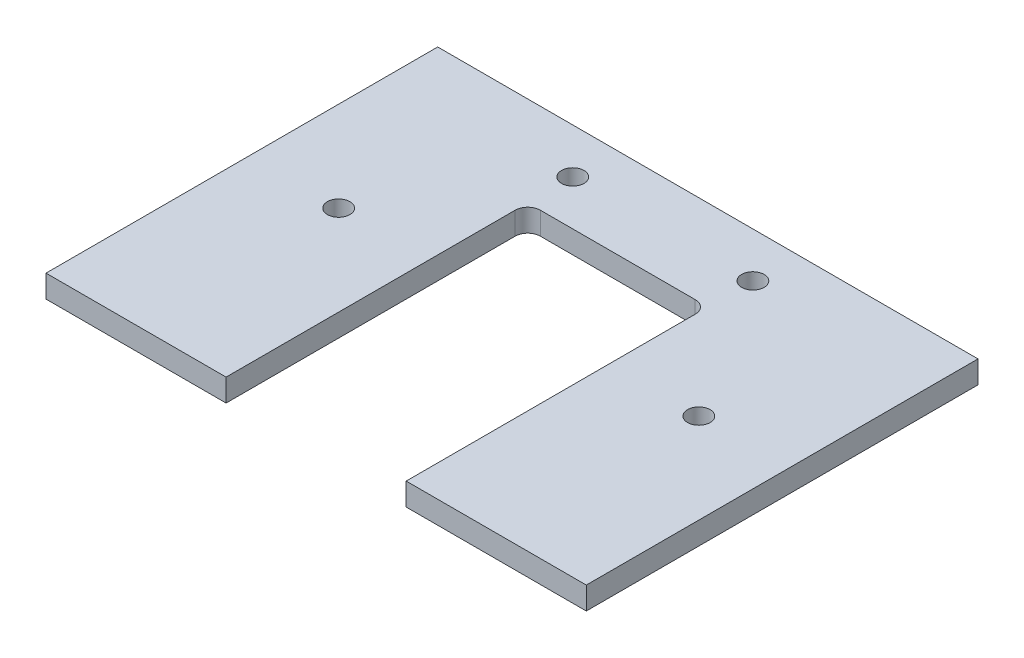
ISO-10303-21;
HEADER;
FILE_DESCRIPTION(('STEP AP214'),'2;1');
FILE_NAME('part.step','',(''),(''),'','','');
FILE_SCHEMA(('AUTOMOTIVE_DESIGN { 1 0 10303 214 1 1 1 1 }'));
ENDSEC;
DATA;
#1=APPLICATION_CONTEXT('core data for automotive mechanical design processes');
#2=APPLICATION_PROTOCOL_DEFINITION('international standard','automotive_design',2000,#1);
#3=PRODUCT_CONTEXT('',#1,'mechanical');
#4=PRODUCT('Part','Part','',(#3));
#5=PRODUCT_RELATED_PRODUCT_CATEGORY('part','',(#4));
#6=PRODUCT_DEFINITION_FORMATION('','',#4);
#7=PRODUCT_DEFINITION_CONTEXT('part definition',#1,'design');
#8=PRODUCT_DEFINITION('design','',#6,#7);
#9=PRODUCT_DEFINITION_SHAPE('','',#8);
#10=(LENGTH_UNIT() NAMED_UNIT(*) SI_UNIT(.MILLI.,.METRE.));
#11=(NAMED_UNIT(*) PLANE_ANGLE_UNIT() SI_UNIT($,.RADIAN.));
#12=(NAMED_UNIT(*) SI_UNIT($,.STERADIAN.) SOLID_ANGLE_UNIT());
#13=UNCERTAINTY_MEASURE_WITH_UNIT(LENGTH_MEASURE(1.E-05),#10,'distance_accuracy_value','');
#14=(GEOMETRIC_REPRESENTATION_CONTEXT(3) GLOBAL_UNCERTAINTY_ASSIGNED_CONTEXT((#13)) GLOBAL_UNIT_ASSIGNED_CONTEXT((#10,
#11,#12)) REPRESENTATION_CONTEXT('',''));
#15=CARTESIAN_POINT('',(0.,0.,0.));
#16=DIRECTION('',(0.,0.,1.));
#17=DIRECTION('',(1.,0.,0.));
#18=AXIS2_PLACEMENT_3D('',#15,#16,#17);
#19=CARTESIAN_POINT('',(-12.7,3.175,42.545));
#20=DIRECTION('',(0.,1.,0.));
#21=DIRECTION('',(0.,0.,1.));
#22=AXIS2_PLACEMENT_3D('',#19,#20,#21);
#23=PLANE('',#22);
#24=CARTESIAN_POINT('',(-12.7,3.175,-6.35));
#25=DIRECTION('',(0.,1.,0.));
#26=DIRECTION('',(0.,0.,1.));
#27=AXIS2_PLACEMENT_3D('',#24,#25,#26);
#28=CIRCLE('',#27,1.5875);
#29=CARTESIAN_POINT('',(-12.7,3.175,-4.7625));
#30=VERTEX_POINT('',#29);
#31=EDGE_CURVE('E379',#30,#30,#28,.T.);
#32=ORIENTED_EDGE('',*,*,#31,.F.);
#33=EDGE_LOOP('',(#32));
#34=FACE_BOUND('',#33,.T.);
#35=CARTESIAN_POINT('',(-25.4,3.175,13.97));
#36=DIRECTION('',(0.,1.,0.));
#37=DIRECTION('',(0.,0.,1.));
#38=AXIS2_PLACEMENT_3D('',#35,#36,#37);
#39=CIRCLE('',#38,1.5875);
#40=CARTESIAN_POINT('',(-25.4,3.175,15.5575));
#41=VERTEX_POINT('',#40);
#42=EDGE_CURVE('E214',#41,#41,#39,.T.);
#43=ORIENTED_EDGE('',*,*,#42,.F.);
#44=EDGE_LOOP('',(#43));
#45=FACE_BOUND('',#44,.T.);
#46=DIRECTION('',(1.,0.,0.));
#47=VECTOR('',#46,1.);
#48=CARTESIAN_POINT('',(-38.1,3.175,42.545));
#49=LINE('',#48,#47);
#50=CARTESIAN_POINT('',(-38.1,3.175,42.545));
#51=VERTEX_POINT('',#50);
#52=CARTESIAN_POINT('',(-12.7,3.175,42.545));
#53=VERTEX_POINT('',#52);
#54=EDGE_CURVE('E115',#51,#53,#49,.T.);
#55=ORIENTED_EDGE('',*,*,#54,.T.);
#56=DIRECTION('',(0.,0.,-1.));
#57=VECTOR('',#56,1.);
#58=CARTESIAN_POINT('',(-12.7,3.175,42.545));
#59=LINE('',#58,#57);
#60=CARTESIAN_POINT('',(-12.7,3.175,1.778));
#61=VERTEX_POINT('',#60);
#62=EDGE_CURVE('E106',#53,#61,#59,.T.);
#63=ORIENTED_EDGE('',*,*,#62,.T.);
#64=CARTESIAN_POINT('',(-10.922,3.175,1.778));
#65=DIRECTION('',(0.,1.,0.));
#66=DIRECTION('',(0.,0.,1.));
#67=AXIS2_PLACEMENT_3D('',#64,#65,#66);
#68=CIRCLE('',#67,1.778);
#69=CARTESIAN_POINT('',(-10.922,3.175,0.));
#70=VERTEX_POINT('',#69);
#71=EDGE_CURVE('E11',#61,#70,#68,.F.);
#72=ORIENTED_EDGE('',*,*,#71,.T.);
#73=DIRECTION('',(1.,0.,0.));
#74=VECTOR('',#73,1.);
#75=CARTESIAN_POINT('',(-12.7,3.175,0.));
#76=LINE('',#75,#74);
#77=CARTESIAN_POINT('',(10.922,3.175,0.));
#78=VERTEX_POINT('',#77);
#79=EDGE_CURVE('E114',#70,#78,#76,.T.);
#80=ORIENTED_EDGE('',*,*,#79,.T.);
#81=CARTESIAN_POINT('',(10.922,3.175,1.778));
#82=DIRECTION('',(0.,1.,0.));
#83=DIRECTION('',(0.,0.,1.));
#84=AXIS2_PLACEMENT_3D('',#81,#82,#83);
#85=CIRCLE('',#84,1.778);
#86=CARTESIAN_POINT('',(12.7,3.175,1.778));
#87=VERTEX_POINT('',#86);
#88=EDGE_CURVE('E147',#78,#87,#85,.F.);
#89=ORIENTED_EDGE('',*,*,#88,.T.);
#90=DIRECTION('',(0.,0.,1.));
#91=VECTOR('',#90,1.);
#92=CARTESIAN_POINT('',(12.7,3.175,42.545));
#93=LINE('',#92,#91);
#94=CARTESIAN_POINT('',(12.7,3.175,42.545));
#95=VERTEX_POINT('',#94);
#96=EDGE_CURVE('E151',#87,#95,#93,.T.);
#97=ORIENTED_EDGE('',*,*,#96,.T.);
#98=DIRECTION('',(1.,0.,0.));
#99=VECTOR('',#98,1.);
#100=CARTESIAN_POINT('',(38.1,3.175,42.545));
#101=LINE('',#100,#99);
#102=CARTESIAN_POINT('',(38.1,3.175,42.545));
#103=VERTEX_POINT('',#102);
#104=EDGE_CURVE('E161',#95,#103,#101,.T.);
#105=ORIENTED_EDGE('',*,*,#104,.T.);
#106=DIRECTION('',(0.,0.,-1.));
#107=VECTOR('',#106,1.);
#108=CARTESIAN_POINT('',(38.1,3.175,-12.7));
#109=LINE('',#108,#107);
#110=CARTESIAN_POINT('',(38.1,3.175,-12.7));
#111=VERTEX_POINT('',#110);
#112=EDGE_CURVE('E200',#103,#111,#109,.T.);
#113=ORIENTED_EDGE('',*,*,#112,.T.);
#114=DIRECTION('',(-1.,0.,0.));
#115=VECTOR('',#114,1.);
#116=CARTESIAN_POINT('',(38.1,3.175,-12.7));
#117=LINE('',#116,#115);
#118=CARTESIAN_POINT('',(-38.1,3.175,-12.7));
#119=VERTEX_POINT('',#118);
#120=EDGE_CURVE('E210',#111,#119,#117,.T.);
#121=ORIENTED_EDGE('',*,*,#120,.T.);
#122=DIRECTION('',(0.,0.,1.));
#123=VECTOR('',#122,1.);
#124=CARTESIAN_POINT('',(-38.1,3.175,-12.7));
#125=LINE('',#124,#123);
#126=EDGE_CURVE('E120',#119,#51,#125,.T.);
#127=ORIENTED_EDGE('',*,*,#126,.T.);
#128=EDGE_LOOP('',(#55,#63,#72,#80,#89,#97,#105,#113,#121,#127));
#129=FACE_BOUND('',#128,.T.);
#130=CARTESIAN_POINT('',(25.4,3.175,13.97));
#131=DIRECTION('',(0.,1.,0.));
#132=DIRECTION('',(0.,0.,-1.));
#133=AXIS2_PLACEMENT_3D('',#130,#131,#132);
#134=CIRCLE('',#133,1.5875);
#135=CARTESIAN_POINT('',(25.4,3.175,12.3825));
#136=VERTEX_POINT('',#135);
#137=EDGE_CURVE('E221',#136,#136,#134,.T.);
#138=ORIENTED_EDGE('',*,*,#137,.F.);
#139=EDGE_LOOP('',(#138));
#140=FACE_BOUND('',#139,.T.);
#141=CARTESIAN_POINT('',(12.7,3.175,-6.35));
#142=DIRECTION('',(0.,1.,0.));
#143=DIRECTION('',(0.,0.,-1.));
#144=AXIS2_PLACEMENT_3D('',#141,#142,#143);
#145=CIRCLE('',#144,1.5875);
#146=CARTESIAN_POINT('',(12.7,3.175,-7.9375));
#147=VERTEX_POINT('',#146);
#148=EDGE_CURVE('E370',#147,#147,#145,.T.);
#149=ORIENTED_EDGE('',*,*,#148,.F.);
#150=EDGE_LOOP('',(#149));
#151=FACE_BOUND('',#150,.T.);
#152=ADVANCED_FACE('F33',(#34,#45,#129,#140,#151),#23,.T.);
#153=CARTESIAN_POINT('',(-12.7,0.,42.545));
#154=DIRECTION('',(0.,1.,0.));
#155=DIRECTION('',(0.,0.,1.));
#156=AXIS2_PLACEMENT_3D('',#153,#154,#155);
#157=PLANE('',#156);
#158=CARTESIAN_POINT('',(-12.7,0.,-6.35));
#159=DIRECTION('',(0.,1.,0.));
#160=DIRECTION('',(0.,0.,1.));
#161=AXIS2_PLACEMENT_3D('',#158,#159,#160);
#162=CIRCLE('',#161,1.5875);
#163=CARTESIAN_POINT('',(-12.7,0.,-4.7625));
#164=VERTEX_POINT('',#163);
#165=EDGE_CURVE('E376',#164,#164,#162,.T.);
#166=ORIENTED_EDGE('',*,*,#165,.T.);
#167=EDGE_LOOP('',(#166));
#168=FACE_BOUND('',#167,.T.);
#169=CARTESIAN_POINT('',(-25.4,0.,13.97));
#170=DIRECTION('',(0.,1.,0.));
#171=DIRECTION('',(0.,0.,1.));
#172=AXIS2_PLACEMENT_3D('',#169,#170,#171);
#173=CIRCLE('',#172,1.5875);
#174=CARTESIAN_POINT('',(-25.4,0.,15.5575));
#175=VERTEX_POINT('',#174);
#176=EDGE_CURVE('E216',#175,#175,#173,.T.);
#177=ORIENTED_EDGE('',*,*,#176,.T.);
#178=EDGE_LOOP('',(#177));
#179=FACE_BOUND('',#178,.T.);
#180=DIRECTION('',(1.,0.,0.));
#181=VECTOR('',#180,1.);
#182=CARTESIAN_POINT('',(-38.1,0.,42.545));
#183=LINE('',#182,#181);
#184=CARTESIAN_POINT('',(-38.1,0.,42.545));
#185=VERTEX_POINT('',#184);
#186=CARTESIAN_POINT('',(-12.7,0.,42.545));
#187=VERTEX_POINT('',#186);
#188=EDGE_CURVE('E128',#185,#187,#183,.T.);
#189=ORIENTED_EDGE('',*,*,#188,.F.);
#190=DIRECTION('',(0.,0.,1.));
#191=VECTOR('',#190,1.);
#192=CARTESIAN_POINT('',(-38.1,0.,-12.7));
#193=LINE('',#192,#191);
#194=CARTESIAN_POINT('',(-38.1,0.,-12.7));
#195=VERTEX_POINT('',#194);
#196=EDGE_CURVE('E124',#195,#185,#193,.T.);
#197=ORIENTED_EDGE('',*,*,#196,.F.);
#198=DIRECTION('',(-1.,0.,0.));
#199=VECTOR('',#198,1.);
#200=CARTESIAN_POINT('',(38.1,0.,-12.7));
#201=LINE('',#200,#199);
#202=CARTESIAN_POINT('',(38.1,0.,-12.7));
#203=VERTEX_POINT('',#202);
#204=EDGE_CURVE('E183',#203,#195,#201,.T.);
#205=ORIENTED_EDGE('',*,*,#204,.F.);
#206=DIRECTION('',(0.,0.,-1.));
#207=VECTOR('',#206,1.);
#208=CARTESIAN_POINT('',(38.1,0.,-12.7));
#209=LINE('',#208,#207);
#210=CARTESIAN_POINT('',(38.1,0.,42.545));
#211=VERTEX_POINT('',#210);
#212=EDGE_CURVE('E181',#211,#203,#209,.T.);
#213=ORIENTED_EDGE('',*,*,#212,.F.);
#214=DIRECTION('',(1.,0.,0.));
#215=VECTOR('',#214,1.);
#216=CARTESIAN_POINT('',(38.1,0.,42.545));
#217=LINE('',#216,#215);
#218=CARTESIAN_POINT('',(12.7,0.,42.545));
#219=VERTEX_POINT('',#218);
#220=EDGE_CURVE('E175',#219,#211,#217,.T.);
#221=ORIENTED_EDGE('',*,*,#220,.F.);
#222=DIRECTION('',(0.,0.,1.));
#223=VECTOR('',#222,1.);
#224=CARTESIAN_POINT('',(12.7,0.,42.545));
#225=LINE('',#224,#223);
#226=CARTESIAN_POINT('',(12.7,0.,1.778));
#227=VERTEX_POINT('',#226);
#228=EDGE_CURVE('E169',#227,#219,#225,.T.);
#229=ORIENTED_EDGE('',*,*,#228,.F.);
#230=CARTESIAN_POINT('',(10.922,0.,1.778));
#231=DIRECTION('',(0.,1.,0.));
#232=DIRECTION('',(0.,0.,1.));
#233=AXIS2_PLACEMENT_3D('',#230,#231,#232);
#234=CIRCLE('',#233,1.778);
#235=CARTESIAN_POINT('',(10.922,0.,0.));
#236=VERTEX_POINT('',#235);
#237=EDGE_CURVE('E145',#227,#236,#234,.T.);
#238=ORIENTED_EDGE('',*,*,#237,.T.);
#239=DIRECTION('',(1.,0.,0.));
#240=VECTOR('',#239,1.);
#241=CARTESIAN_POINT('',(-12.7,0.,0.));
#242=LINE('',#241,#240);
#243=CARTESIAN_POINT('',(-10.922,0.,0.));
#244=VERTEX_POINT('',#243);
#245=EDGE_CURVE('E167',#244,#236,#242,.T.);
#246=ORIENTED_EDGE('',*,*,#245,.F.);
#247=CARTESIAN_POINT('',(-10.922,0.,1.778));
#248=DIRECTION('',(0.,1.,0.));
#249=DIRECTION('',(0.,0.,1.));
#250=AXIS2_PLACEMENT_3D('',#247,#248,#249);
#251=CIRCLE('',#250,1.778);
#252=CARTESIAN_POINT('',(-12.7,0.,1.778));
#253=VERTEX_POINT('',#252);
#254=EDGE_CURVE('E41',#244,#253,#251,.T.);
#255=ORIENTED_EDGE('',*,*,#254,.T.);
#256=DIRECTION('',(0.,0.,-1.));
#257=VECTOR('',#256,1.);
#258=CARTESIAN_POINT('',(-12.7,0.,42.545));
#259=LINE('',#258,#257);
#260=EDGE_CURVE('E173',#187,#253,#259,.T.);
#261=ORIENTED_EDGE('',*,*,#260,.F.);
#262=EDGE_LOOP('',(#189,#197,#205,#213,#221,#229,#238,#246,#255,#261));
#263=FACE_BOUND('',#262,.T.);
#264=CARTESIAN_POINT('',(25.4,0.,13.97));
#265=DIRECTION('',(0.,1.,0.));
#266=DIRECTION('',(0.,0.,-1.));
#267=AXIS2_PLACEMENT_3D('',#264,#265,#266);
#268=CIRCLE('',#267,1.5875);
#269=CARTESIAN_POINT('',(25.4,0.,12.3825));
#270=VERTEX_POINT('',#269);
#271=EDGE_CURVE('E224',#270,#270,#268,.T.);
#272=ORIENTED_EDGE('',*,*,#271,.T.);
#273=EDGE_LOOP('',(#272));
#274=FACE_BOUND('',#273,.T.);
#275=CARTESIAN_POINT('',(12.7,0.,-6.35));
#276=DIRECTION('',(0.,1.,0.));
#277=DIRECTION('',(0.,0.,-1.));
#278=AXIS2_PLACEMENT_3D('',#275,#276,#277);
#279=CIRCLE('',#278,1.5875);
#280=CARTESIAN_POINT('',(12.7,0.,-7.9375));
#281=VERTEX_POINT('',#280);
#282=EDGE_CURVE('E373',#281,#281,#279,.T.);
#283=ORIENTED_EDGE('',*,*,#282,.T.);
#284=EDGE_LOOP('',(#283));
#285=FACE_BOUND('',#284,.T.);
#286=ADVANCED_FACE('F165',(#168,#179,#263,#274,#285),#157,.F.);
#287=CARTESIAN_POINT('',(-38.1,3.175,42.545));
#288=DIRECTION('',(0.,0.,-1.));
#289=DIRECTION('',(-1.,0.,0.));
#290=AXIS2_PLACEMENT_3D('',#287,#288,#289);
#291=PLANE('',#290);
#292=ORIENTED_EDGE('',*,*,#188,.T.);
#293=DIRECTION('',(0.,-1.,0.));
#294=VECTOR('',#293,1.);
#295=CARTESIAN_POINT('',(-12.7,3.175,42.545));
#296=LINE('',#295,#294);
#297=EDGE_CURVE('E110',#53,#187,#296,.T.);
#298=ORIENTED_EDGE('',*,*,#297,.F.);
#299=ORIENTED_EDGE('',*,*,#54,.F.);
#300=DIRECTION('',(0.,-1.,0.));
#301=VECTOR('',#300,1.);
#302=CARTESIAN_POINT('',(-38.1,3.175,42.545));
#303=LINE('',#302,#301);
#304=EDGE_CURVE('E186',#51,#185,#303,.T.);
#305=ORIENTED_EDGE('',*,*,#304,.T.);
#306=EDGE_LOOP('',(#292,#298,#299,#305));
#307=FACE_BOUND('',#306,.T.);
#308=ADVANCED_FACE('F126',(#307),#291,.F.);
#309=CARTESIAN_POINT('',(-12.7,3.175,42.545));
#310=DIRECTION('',(-1.,0.,0.));
#311=DIRECTION('',(0.,0.,1.));
#312=AXIS2_PLACEMENT_3D('',#309,#310,#311);
#313=PLANE('',#312);
#314=ORIENTED_EDGE('',*,*,#260,.T.);
#315=DIRECTION('',(0.,-1.,0.));
#316=VECTOR('',#315,1.);
#317=CARTESIAN_POINT('',(-12.7,3.175,1.778));
#318=LINE('',#317,#316);
#319=EDGE_CURVE('E48',#253,#61,#318,.F.);
#320=ORIENTED_EDGE('',*,*,#319,.T.);
#321=ORIENTED_EDGE('',*,*,#62,.F.);
#322=ORIENTED_EDGE('',*,*,#297,.T.);
#323=EDGE_LOOP('',(#314,#320,#321,#322));
#324=FACE_BOUND('',#323,.T.);
#325=ADVANCED_FACE('F108',(#324),#313,.F.);
#326=CARTESIAN_POINT('',(-12.7,3.175,0.));
#327=DIRECTION('',(0.,0.,-1.));
#328=DIRECTION('',(-1.,0.,0.));
#329=AXIS2_PLACEMENT_3D('',#326,#327,#328);
#330=PLANE('',#329);
#331=ORIENTED_EDGE('',*,*,#245,.T.);
#332=DIRECTION('',(0.,-1.,0.));
#333=VECTOR('',#332,1.);
#334=CARTESIAN_POINT('',(10.922,3.175,0.));
#335=LINE('',#334,#333);
#336=EDGE_CURVE('E142',#236,#78,#335,.F.);
#337=ORIENTED_EDGE('',*,*,#336,.T.);
#338=ORIENTED_EDGE('',*,*,#79,.F.);
#339=DIRECTION('',(0.,-1.,0.));
#340=VECTOR('',#339,1.);
#341=CARTESIAN_POINT('',(-10.922,0.,0.));
#342=LINE('',#341,#340);
#343=EDGE_CURVE('E133',#70,#244,#342,.T.);
#344=ORIENTED_EDGE('',*,*,#343,.T.);
#345=EDGE_LOOP('',(#331,#337,#338,#344));
#346=FACE_BOUND('',#345,.T.);
#347=ADVANCED_FACE('F171',(#346),#330,.F.);
#348=CARTESIAN_POINT('',(12.7,3.175,42.545));
#349=DIRECTION('',(1.,0.,0.));
#350=DIRECTION('',(0.,0.,-1.));
#351=AXIS2_PLACEMENT_3D('',#348,#349,#350);
#352=PLANE('',#351);
#353=ORIENTED_EDGE('',*,*,#96,.F.);
#354=DIRECTION('',(0.,-1.,0.));
#355=VECTOR('',#354,1.);
#356=CARTESIAN_POINT('',(12.7,0.,1.778));
#357=LINE('',#356,#355);
#358=EDGE_CURVE('E129',#87,#227,#357,.T.);
#359=ORIENTED_EDGE('',*,*,#358,.T.);
#360=ORIENTED_EDGE('',*,*,#228,.T.);
#361=DIRECTION('',(0.,-1.,0.));
#362=VECTOR('',#361,1.);
#363=CARTESIAN_POINT('',(12.7,3.175,42.545));
#364=LINE('',#363,#362);
#365=EDGE_CURVE('E130',#95,#219,#364,.T.);
#366=ORIENTED_EDGE('',*,*,#365,.F.);
#367=EDGE_LOOP('',(#353,#359,#360,#366));
#368=FACE_BOUND('',#367,.T.);
#369=ADVANCED_FACE('F158',(#368),#352,.F.);
#370=CARTESIAN_POINT('',(38.1,3.175,42.545));
#371=DIRECTION('',(0.,0.,-1.));
#372=DIRECTION('',(-1.,0.,0.));
#373=AXIS2_PLACEMENT_3D('',#370,#371,#372);
#374=PLANE('',#373);
#375=ORIENTED_EDGE('',*,*,#220,.T.);
#376=DIRECTION('',(0.,-1.,0.));
#377=VECTOR('',#376,1.);
#378=CARTESIAN_POINT('',(38.1,3.175,42.545));
#379=LINE('',#378,#377);
#380=EDGE_CURVE('E136',#103,#211,#379,.T.);
#381=ORIENTED_EDGE('',*,*,#380,.F.);
#382=ORIENTED_EDGE('',*,*,#104,.F.);
#383=ORIENTED_EDGE('',*,*,#365,.T.);
#384=EDGE_LOOP('',(#375,#381,#382,#383));
#385=FACE_BOUND('',#384,.T.);
#386=ADVANCED_FACE('F228',(#385),#374,.F.);
#387=CARTESIAN_POINT('',(38.1,3.175,-12.7));
#388=DIRECTION('',(-1.,0.,0.));
#389=DIRECTION('',(0.,0.,1.));
#390=AXIS2_PLACEMENT_3D('',#387,#388,#389);
#391=PLANE('',#390);
#392=ORIENTED_EDGE('',*,*,#212,.T.);
#393=DIRECTION('',(0.,-1.,0.));
#394=VECTOR('',#393,1.);
#395=CARTESIAN_POINT('',(38.1,3.175,-12.7));
#396=LINE('',#395,#394);
#397=EDGE_CURVE('E191',#111,#203,#396,.T.);
#398=ORIENTED_EDGE('',*,*,#397,.F.);
#399=ORIENTED_EDGE('',*,*,#112,.F.);
#400=ORIENTED_EDGE('',*,*,#380,.T.);
#401=EDGE_LOOP('',(#392,#398,#399,#400));
#402=FACE_BOUND('',#401,.T.);
#403=ADVANCED_FACE('F198',(#402),#391,.F.);
#404=CARTESIAN_POINT('',(38.1,3.175,-12.7));
#405=DIRECTION('',(0.,0.,1.));
#406=DIRECTION('',(1.,0.,0.));
#407=AXIS2_PLACEMENT_3D('',#404,#405,#406);
#408=PLANE('',#407);
#409=ORIENTED_EDGE('',*,*,#204,.T.);
#410=DIRECTION('',(0.,-1.,0.));
#411=VECTOR('',#410,1.);
#412=CARTESIAN_POINT('',(-38.1,3.175,-12.7));
#413=LINE('',#412,#411);
#414=EDGE_CURVE('E188',#119,#195,#413,.T.);
#415=ORIENTED_EDGE('',*,*,#414,.F.);
#416=ORIENTED_EDGE('',*,*,#120,.F.);
#417=ORIENTED_EDGE('',*,*,#397,.T.);
#418=EDGE_LOOP('',(#409,#415,#416,#417));
#419=FACE_BOUND('',#418,.T.);
#420=ADVANCED_FACE('F206',(#419),#408,.F.);
#421=CARTESIAN_POINT('',(-38.1,3.175,-12.7));
#422=DIRECTION('',(1.,0.,0.));
#423=DIRECTION('',(0.,0.,-1.));
#424=AXIS2_PLACEMENT_3D('',#421,#422,#423);
#425=PLANE('',#424);
#426=ORIENTED_EDGE('',*,*,#196,.T.);
#427=ORIENTED_EDGE('',*,*,#304,.F.);
#428=ORIENTED_EDGE('',*,*,#126,.F.);
#429=ORIENTED_EDGE('',*,*,#414,.T.);
#430=EDGE_LOOP('',(#426,#427,#428,#429));
#431=FACE_BOUND('',#430,.T.);
#432=ADVANCED_FACE('F209',(#431),#425,.F.);
#433=CARTESIAN_POINT('',(-25.4,3.175,13.97));
#434=DIRECTION('',(0.,-1.,0.));
#435=DIRECTION('',(0.,0.,-1.));
#436=AXIS2_PLACEMENT_3D('',#433,#434,#435);
#437=CYLINDRICAL_SURFACE('',#436,1.5875);
#438=ORIENTED_EDGE('',*,*,#42,.T.);
#439=EDGE_LOOP('',(#438));
#440=FACE_BOUND('',#439,.T.);
#441=ORIENTED_EDGE('',*,*,#176,.F.);
#442=EDGE_LOOP('',(#441));
#443=FACE_BOUND('',#442,.T.);
#444=ADVANCED_FACE('F248',(#440,#443),#437,.F.);
#445=CARTESIAN_POINT('',(25.4,3.175,13.97));
#446=DIRECTION('',(0.,-1.,0.));
#447=DIRECTION('',(0.,0.,-1.));
#448=AXIS2_PLACEMENT_3D('',#445,#446,#447);
#449=CYLINDRICAL_SURFACE('',#448,1.5875);
#450=ORIENTED_EDGE('',*,*,#137,.T.);
#451=EDGE_LOOP('',(#450));
#452=FACE_BOUND('',#451,.T.);
#453=ORIENTED_EDGE('',*,*,#271,.F.);
#454=EDGE_LOOP('',(#453));
#455=FACE_BOUND('',#454,.T.);
#456=ADVANCED_FACE('F268',(#452,#455),#449,.F.);
#457=CARTESIAN_POINT('',(-12.7,3.175,-6.35));
#458=DIRECTION('',(0.,-1.,0.));
#459=DIRECTION('',(0.,0.,-1.));
#460=AXIS2_PLACEMENT_3D('',#457,#458,#459);
#461=CYLINDRICAL_SURFACE('',#460,1.5875);
#462=ORIENTED_EDGE('',*,*,#31,.T.);
#463=EDGE_LOOP('',(#462));
#464=FACE_BOUND('',#463,.T.);
#465=ORIENTED_EDGE('',*,*,#165,.F.);
#466=EDGE_LOOP('',(#465));
#467=FACE_BOUND('',#466,.T.);
#468=ADVANCED_FACE('F274',(#464,#467),#461,.F.);
#469=CARTESIAN_POINT('',(12.7,3.175,-6.35));
#470=DIRECTION('',(0.,-1.,0.));
#471=DIRECTION('',(0.,0.,-1.));
#472=AXIS2_PLACEMENT_3D('',#469,#470,#471);
#473=CYLINDRICAL_SURFACE('',#472,1.5875);
#474=ORIENTED_EDGE('',*,*,#148,.T.);
#475=EDGE_LOOP('',(#474));
#476=FACE_BOUND('',#475,.T.);
#477=ORIENTED_EDGE('',*,*,#282,.F.);
#478=EDGE_LOOP('',(#477));
#479=FACE_BOUND('',#478,.T.);
#480=ADVANCED_FACE('F281',(#476,#479),#473,.F.);
#481=CARTESIAN_POINT('',(10.922,3.175,1.778));
#482=DIRECTION('',(0.,1.,0.));
#483=DIRECTION('',(0.,0.,1.));
#484=AXIS2_PLACEMENT_3D('',#481,#482,#483);
#485=CYLINDRICAL_SURFACE('',#484,1.778);
#486=ORIENTED_EDGE('',*,*,#88,.F.);
#487=ORIENTED_EDGE('',*,*,#336,.F.);
#488=ORIENTED_EDGE('',*,*,#237,.F.);
#489=ORIENTED_EDGE('',*,*,#358,.F.);
#490=EDGE_LOOP('',(#486,#487,#488,#489));
#491=FACE_BOUND('',#490,.T.);
#492=ADVANCED_FACE('F163',(#491),#485,.F.);
#493=CARTESIAN_POINT('',(-10.922,3.175,1.778));
#494=DIRECTION('',(0.,1.,0.));
#495=DIRECTION('',(0.,0.,1.));
#496=AXIS2_PLACEMENT_3D('',#493,#494,#495);
#497=CYLINDRICAL_SURFACE('',#496,1.778);
#498=ORIENTED_EDGE('',*,*,#71,.F.);
#499=ORIENTED_EDGE('',*,*,#319,.F.);
#500=ORIENTED_EDGE('',*,*,#254,.F.);
#501=ORIENTED_EDGE('',*,*,#343,.F.);
#502=EDGE_LOOP('',(#498,#499,#500,#501));
#503=FACE_BOUND('',#502,.T.);
#504=ADVANCED_FACE('F35',(#503),#497,.F.);
#505=CLOSED_SHELL('',(#152,#286,#308,#325,#347,#369,#386,#403,#420,#432,#444,#456,#468,#480,
#492,#504));
#506=MANIFOLD_SOLID_BREP('B2',#505);
#507=ADVANCED_BREP_SHAPE_REPRESENTATION('',(#18,#506),#14);
#508=SHAPE_DEFINITION_REPRESENTATION(#9,#507);
ENDSEC;
END-ISO-10303-21;
